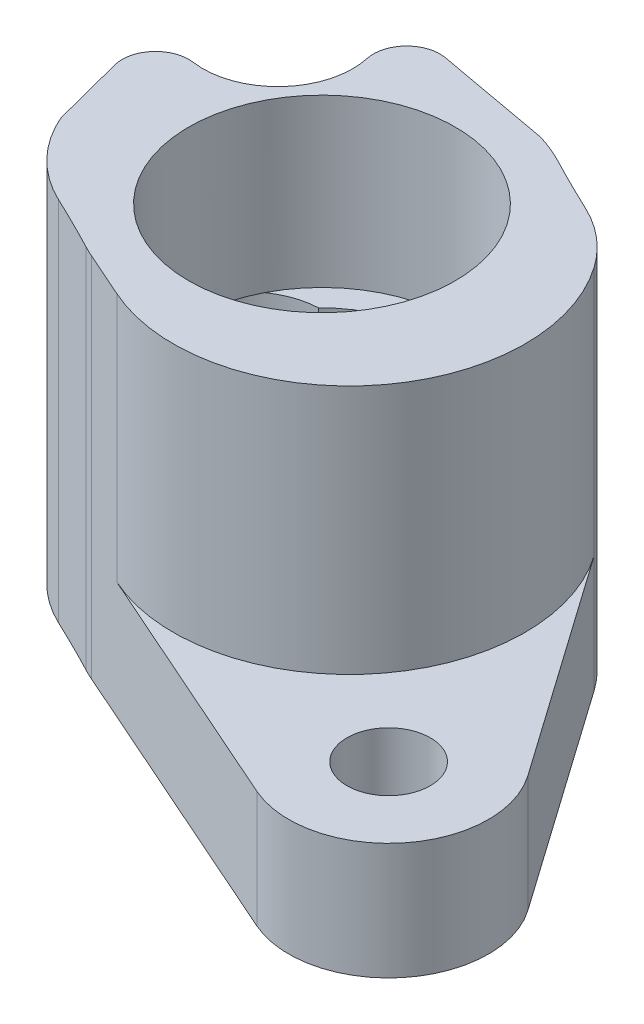
ISO-10303-21;
HEADER;
FILE_DESCRIPTION(('STEP AP214'),'2;1');
FILE_NAME('part.step','',(''),(''),'','','');
FILE_SCHEMA(('AUTOMOTIVE_DESIGN { 1 0 10303 214 1 1 1 1 }'));
ENDSEC;
DATA;
#1=APPLICATION_CONTEXT('core data for automotive mechanical design processes');
#2=APPLICATION_PROTOCOL_DEFINITION('international standard','automotive_design',2000,#1);
#3=PRODUCT_CONTEXT('',#1,'mechanical');
#4=PRODUCT('Part','Part','',(#3));
#5=PRODUCT_RELATED_PRODUCT_CATEGORY('part','',(#4));
#6=PRODUCT_DEFINITION_FORMATION('','',#4);
#7=PRODUCT_DEFINITION_CONTEXT('part definition',#1,'design');
#8=PRODUCT_DEFINITION('design','',#6,#7);
#9=PRODUCT_DEFINITION_SHAPE('','',#8);
#10=(LENGTH_UNIT() NAMED_UNIT(*) SI_UNIT(.MILLI.,.METRE.));
#11=(NAMED_UNIT(*) PLANE_ANGLE_UNIT() SI_UNIT($,.RADIAN.));
#12=(NAMED_UNIT(*) SI_UNIT($,.STERADIAN.) SOLID_ANGLE_UNIT());
#13=UNCERTAINTY_MEASURE_WITH_UNIT(LENGTH_MEASURE(1.E-05),#10,'distance_accuracy_value','');
#14=(GEOMETRIC_REPRESENTATION_CONTEXT(3) GLOBAL_UNCERTAINTY_ASSIGNED_CONTEXT((#13)) GLOBAL_UNIT_ASSIGNED_CONTEXT((#10,
#11,#12)) REPRESENTATION_CONTEXT('',''));
#15=CARTESIAN_POINT('',(0.,0.,0.));
#16=DIRECTION('',(0.,0.,1.));
#17=DIRECTION('',(1.,0.,0.));
#18=AXIS2_PLACEMENT_3D('',#15,#16,#17);
#19=CARTESIAN_POINT('',(4.5,7.,0.));
#20=DIRECTION('',(0.,-1.,0.));
#21=DIRECTION('',(0.,0.,-1.));
#22=AXIS2_PLACEMENT_3D('',#19,#20,#21);
#23=CYLINDRICAL_SURFACE('',#22,4.5);
#24=CARTESIAN_POINT('',(4.5,12.,0.));
#25=DIRECTION('',(0.,1.,0.));
#26=DIRECTION('',(0.,0.,1.));
#27=AXIS2_PLACEMENT_3D('',#24,#25,#26);
#28=CIRCLE('',#27,4.5);
#29=CARTESIAN_POINT('',(4.69444444444444,12.,4.49579707705149));
#30=VERTEX_POINT('',#29);
#31=CARTESIAN_POINT('',(7.11111111111111,12.,3.66498277832681));
#32=VERTEX_POINT('',#31);
#33=EDGE_CURVE('E221',#30,#32,#28,.T.);
#34=ORIENTED_EDGE('',*,*,#33,.T.);
#35=CARTESIAN_POINT('',(4.5,12.,0.));
#36=DIRECTION('',(0.,1.,0.));
#37=DIRECTION('',(0.,0.,1.));
#38=AXIS2_PLACEMENT_3D('',#35,#36,#37);
#39=CIRCLE('',#38,4.5);
#40=CARTESIAN_POINT('',(7.11111111111111,12.,-3.66498277832681));
#41=VERTEX_POINT('',#40);
#42=EDGE_CURVE('E207',#32,#41,#39,.T.);
#43=ORIENTED_EDGE('',*,*,#42,.T.);
#44=CARTESIAN_POINT('',(4.69444444444444,12.,-4.49579707705149));
#45=VERTEX_POINT('',#44);
#46=EDGE_CURVE('E218',#41,#45,#28,.T.);
#47=ORIENTED_EDGE('',*,*,#46,.T.);
#48=DIRECTION('',(0.,-1.,0.));
#49=VECTOR('',#48,1.);
#50=CARTESIAN_POINT('',(4.69444444444444,7.,-4.49579707705149));
#51=LINE('',#50,#49);
#52=CARTESIAN_POINT('',(4.69444444444444,0.,-4.49579707705149));
#53=VERTEX_POINT('',#52);
#54=EDGE_CURVE('E442',#45,#53,#51,.T.);
#55=ORIENTED_EDGE('',*,*,#54,.T.);
#56=CARTESIAN_POINT('',(4.5,0.,0.));
#57=DIRECTION('',(0.,1.,0.));
#58=DIRECTION('',(0.,0.,1.));
#59=AXIS2_PLACEMENT_3D('',#56,#57,#58);
#60=CIRCLE('',#59,4.5);
#61=CARTESIAN_POINT('',(4.69444444444444,0.,4.49579707705149));
#62=VERTEX_POINT('',#61);
#63=EDGE_CURVE('E381',#62,#53,#60,.T.);
#64=ORIENTED_EDGE('',*,*,#63,.F.);
#65=DIRECTION('',(0.,-1.,0.));
#66=VECTOR('',#65,1.);
#67=CARTESIAN_POINT('',(4.69444444444444,7.,4.49579707705149));
#68=LINE('',#67,#66);
#69=EDGE_CURVE('E473',#30,#62,#68,.T.);
#70=ORIENTED_EDGE('',*,*,#69,.F.);
#71=EDGE_LOOP('',(#34,#43,#47,#55,#64,#70));
#72=FACE_BOUND('',#71,.T.);
#73=ADVANCED_FACE('F41',(#72),#23,.F.);
#74=CARTESIAN_POINT('',(-4.5,7.,0.));
#75=DIRECTION('',(0.,-1.,0.));
#76=DIRECTION('',(0.,0.,-1.));
#77=AXIS2_PLACEMENT_3D('',#74,#75,#76);
#78=CYLINDRICAL_SURFACE('',#77,4.5);
#79=CARTESIAN_POINT('',(-4.5,12.,0.));
#80=DIRECTION('',(0.,1.,0.));
#81=DIRECTION('',(0.,0.,1.));
#82=AXIS2_PLACEMENT_3D('',#79,#80,#81);
#83=CIRCLE('',#82,4.5);
#84=CARTESIAN_POINT('',(-7.11111111111111,12.,-3.66498277832681));
#85=VERTEX_POINT('',#84);
#86=CARTESIAN_POINT('',(-7.11111111111111,12.,3.66498277832681));
#87=VERTEX_POINT('',#86);
#88=EDGE_CURVE('E223',#85,#87,#83,.T.);
#89=ORIENTED_EDGE('',*,*,#88,.T.);
#90=CARTESIAN_POINT('',(-4.5,12.,0.));
#91=DIRECTION('',(0.,1.,0.));
#92=DIRECTION('',(0.,0.,1.));
#93=AXIS2_PLACEMENT_3D('',#90,#91,#92);
#94=CIRCLE('',#93,4.5);
#95=CARTESIAN_POINT('',(-4.69444444444444,12.,4.49579707705149));
#96=VERTEX_POINT('',#95);
#97=EDGE_CURVE('E45',#96,#87,#94,.F.);
#98=ORIENTED_EDGE('',*,*,#97,.F.);
#99=DIRECTION('',(0.,-1.,0.));
#100=VECTOR('',#99,1.);
#101=CARTESIAN_POINT('',(-4.69444444444444,7.,4.49579707705149));
#102=LINE('',#101,#100);
#103=CARTESIAN_POINT('',(-4.69444444444444,0.,4.49579707705149));
#104=VERTEX_POINT('',#103);
#105=EDGE_CURVE('E470',#96,#104,#102,.T.);
#106=ORIENTED_EDGE('',*,*,#105,.T.);
#107=CARTESIAN_POINT('',(-4.5,0.,0.));
#108=DIRECTION('',(0.,1.,0.));
#109=DIRECTION('',(0.,0.,1.));
#110=AXIS2_PLACEMENT_3D('',#107,#108,#109);
#111=CIRCLE('',#110,4.5);
#112=CARTESIAN_POINT('',(-4.69444444444445,0.,-4.49579707705149));
#113=VERTEX_POINT('',#112);
#114=EDGE_CURVE('E389',#104,#113,#111,.F.);
#115=ORIENTED_EDGE('',*,*,#114,.T.);
#116=DIRECTION('',(0.,-1.,0.));
#117=VECTOR('',#116,1.);
#118=CARTESIAN_POINT('',(-4.69444444444445,7.,-4.49579707705149));
#119=LINE('',#118,#117);
#120=CARTESIAN_POINT('',(-4.69444444444445,12.,-4.49579707705149));
#121=VERTEX_POINT('',#120);
#122=EDGE_CURVE('E377',#121,#113,#119,.T.);
#123=ORIENTED_EDGE('',*,*,#122,.F.);
#124=EDGE_CURVE('E11',#85,#121,#94,.F.);
#125=ORIENTED_EDGE('',*,*,#124,.F.);
#126=EDGE_LOOP('',(#89,#98,#106,#115,#123,#125));
#127=FACE_BOUND('',#126,.T.);
#128=ADVANCED_FACE('F511',(#127),#78,.F.);
#129=CARTESIAN_POINT('',(0.,7.,0.));
#130=DIRECTION('',(0.,-1.,0.));
#131=DIRECTION('',(0.,0.,-1.));
#132=AXIS2_PLACEMENT_3D('',#129,#130,#131);
#133=CYLINDRICAL_SURFACE('',#132,6.5);
#134=ORIENTED_EDGE('',*,*,#54,.F.);
#135=CARTESIAN_POINT('',(0.,12.,0.));
#136=DIRECTION('',(0.,1.,0.));
#137=DIRECTION('',(0.,0.,1.));
#138=AXIS2_PLACEMENT_3D('',#135,#136,#137);
#139=CIRCLE('',#138,6.5);
#140=EDGE_CURVE('E230',#45,#121,#139,.T.);
#141=ORIENTED_EDGE('',*,*,#140,.T.);
#142=ORIENTED_EDGE('',*,*,#122,.T.);
#143=CARTESIAN_POINT('',(0.,0.,0.));
#144=DIRECTION('',(0.,1.,0.));
#145=DIRECTION('',(0.,0.,1.));
#146=AXIS2_PLACEMENT_3D('',#143,#144,#145);
#147=CIRCLE('',#146,6.5);
#148=EDGE_CURVE('E345',#53,#113,#147,.T.);
#149=ORIENTED_EDGE('',*,*,#148,.F.);
#150=EDGE_LOOP('',(#134,#141,#142,#149));
#151=FACE_BOUND('',#150,.T.);
#152=ADVANCED_FACE('F514',(#151),#133,.F.);
#153=CARTESIAN_POINT('',(0.,7.,0.));
#154=DIRECTION('',(0.,-1.,0.));
#155=DIRECTION('',(0.,0.,-1.));
#156=AXIS2_PLACEMENT_3D('',#153,#154,#155);
#157=CYLINDRICAL_SURFACE('',#156,6.5);
#158=ORIENTED_EDGE('',*,*,#105,.F.);
#159=CARTESIAN_POINT('',(0.,12.,0.));
#160=DIRECTION('',(0.,1.,0.));
#161=DIRECTION('',(0.,0.,1.));
#162=AXIS2_PLACEMENT_3D('',#159,#160,#161);
#163=CIRCLE('',#162,6.5);
#164=EDGE_CURVE('E239',#96,#30,#163,.T.);
#165=ORIENTED_EDGE('',*,*,#164,.T.);
#166=ORIENTED_EDGE('',*,*,#69,.T.);
#167=CARTESIAN_POINT('',(0.,0.,0.));
#168=DIRECTION('',(0.,1.,0.));
#169=DIRECTION('',(0.,0.,1.));
#170=AXIS2_PLACEMENT_3D('',#167,#168,#169);
#171=CIRCLE('',#170,6.5);
#172=EDGE_CURVE('E385',#104,#62,#171,.T.);
#173=ORIENTED_EDGE('',*,*,#172,.F.);
#174=EDGE_LOOP('',(#158,#165,#166,#173));
#175=FACE_BOUND('',#174,.T.);
#176=ADVANCED_FACE('F523',(#175),#157,.F.);
#177=CARTESIAN_POINT('',(0.,7.,0.));
#178=DIRECTION('',(0.,1.,0.));
#179=DIRECTION('',(0.,0.,1.));
#180=AXIS2_PLACEMENT_3D('',#177,#178,#179);
#181=PLANE('',#180);
#182=CARTESIAN_POINT('',(16.0000000000001,7.,12.));
#183=DIRECTION('',(0.,1.,0.));
#184=DIRECTION('',(0.,0.,1.));
#185=AXIS2_PLACEMENT_3D('',#182,#183,#184);
#186=CIRCLE('',#185,2.5);
#187=CARTESIAN_POINT('',(16.0000000000001,7.,14.5));
#188=VERTEX_POINT('',#187);
#189=EDGE_CURVE('E346',#188,#188,#186,.T.);
#190=ORIENTED_EDGE('',*,*,#189,.F.);
#191=EDGE_LOOP('',(#190));
#192=FACE_BOUND('',#191,.T.);
#193=CARTESIAN_POINT('',(2.81741341811794,7.,1.18386679753758));
#194=DIRECTION('',(0.,1.,0.));
#195=DIRECTION('',(0.,0.,1.));
#196=AXIS2_PLACEMENT_3D('',#193,#194,#195);
#197=CIRCLE('',#196,10.5573376484771);
#198=CARTESIAN_POINT('',(-1.4542464793394,7.,10.8384149456597));
#199=VERTEX_POINT('',#198);
#200=CARTESIAN_POINT('',(11.4516960215957,7.,-4.89120868736258));
#201=VERTEX_POINT('',#200);
#202=EDGE_CURVE('E310',#199,#201,#197,.T.);
#203=ORIENTED_EDGE('',*,*,#202,.F.);
#204=DIRECTION('',(0.914487010796204,0.,0.40461525809715));
#205=VECTOR('',#204,1.);
#206=CARTESIAN_POINT('',(-4.24846021002008,7.,9.60211361336014));
#207=LINE('',#206,#205);
#208=CARTESIAN_POINT('',(13.5723084514172,7.,17.4869220647772));
#209=VERTEX_POINT('',#208);
#210=EDGE_CURVE('E367',#199,#209,#207,.T.);
#211=ORIENTED_EDGE('',*,*,#210,.T.);
#212=CARTESIAN_POINT('',(16.0000000000001,7.,12.));
#213=DIRECTION('',(0.,1.,0.));
#214=DIRECTION('',(0.,0.,1.));
#215=AXIS2_PLACEMENT_3D('',#212,#213,#214);
#216=CIRCLE('',#215,6.);
#217=CARTESIAN_POINT('',(20.9070795446559,7.,8.54738210303818));
#218=VERTEX_POINT('',#217);
#219=EDGE_CURVE('E370',#209,#218,#216,.T.);
#220=ORIENTED_EDGE('',*,*,#219,.T.);
#221=DIRECTION('',(0.575436316160303,0.,0.81784659077596));
#222=VECTOR('',#221,1.);
#223=CARTESIAN_POINT('',(9.96162472879303,7.,-7.00899251957429));
#224=LINE('',#223,#222);
#225=EDGE_CURVE('E373',#201,#218,#224,.T.);
#226=ORIENTED_EDGE('',*,*,#225,.F.);
#227=EDGE_LOOP('',(#203,#211,#220,#226));
#228=FACE_BOUND('',#227,.T.);
#229=ADVANCED_FACE('F525',(#192,#228),#181,.T.);
#230=CARTESIAN_POINT('',(3.10184507129617,7.,-10.0313786267729));
#231=DIRECTION('',(0.295413816313921,0.,-0.955369393025988));
#232=DIRECTION('',(-0.955369393025988,0.,-0.295413816313921));
#233=AXIS2_PLACEMENT_3D('',#230,#231,#232);
#234=PLANE('',#233);
#235=DIRECTION('',(0.955369393025988,0.,0.295413816313921));
#236=VECTOR('',#235,1.);
#237=CARTESIAN_POINT('',(3.10184507129617,0.,-10.0313786267729));
#238=LINE('',#237,#236);
#239=CARTESIAN_POINT('',(-8.82169982054453,0.,-13.7183084428228));
#240=VERTEX_POINT('',#239);
#241=CARTESIAN_POINT('',(3.10184507129617,0.,-10.0313786267729));
#242=VERTEX_POINT('',#241);
#243=EDGE_CURVE('E401',#240,#242,#238,.T.);
#244=ORIENTED_EDGE('',*,*,#243,.F.);
#245=DIRECTION('',(0.,-1.,0.));
#246=VECTOR('',#245,1.);
#247=CARTESIAN_POINT('',(-8.82169982054453,7.,-13.7183084428228));
#248=LINE('',#247,#246);
#249=CARTESIAN_POINT('',(-8.82169982054453,7.,-13.7183084428228));
#250=VERTEX_POINT('',#249);
#251=EDGE_CURVE('E464',#250,#240,#248,.T.);
#252=ORIENTED_EDGE('',*,*,#251,.F.);
#253=DIRECTION('',(0.955369393025988,0.,0.295413816313921));
#254=VECTOR('',#253,1.);
#255=CARTESIAN_POINT('',(3.10184507129617,7.,-10.0313786267729));
#256=LINE('',#255,#254);
#257=CARTESIAN_POINT('',(3.10184507129618,7.,-10.0313786267729));
#258=VERTEX_POINT('',#257);
#259=EDGE_CURVE('E355',#250,#258,#256,.T.);
#260=ORIENTED_EDGE('',*,*,#259,.T.);
#261=DIRECTION('',(0.,-1.,0.));
#262=VECTOR('',#261,1.);
#263=CARTESIAN_POINT('',(3.10184507129617,7.,-10.0313786267729));
#264=LINE('',#263,#262);
#265=EDGE_CURVE('E437',#258,#242,#264,.T.);
#266=ORIENTED_EDGE('',*,*,#265,.T.);
#267=EDGE_LOOP('',(#244,#252,#260,#266));
#268=FACE_BOUND('',#267,.T.);
#269=ADVANCED_FACE('F531',(#268),#234,.T.);
#270=CARTESIAN_POINT('',(-10.6043370878193,7.,-7.95325281586443));
#271=DIRECTION('',(0.,-1.,0.));
#272=DIRECTION('',(0.,0.,-1.));
#273=AXIS2_PLACEMENT_3D('',#270,#271,#272);
#274=CYLINDRICAL_SURFACE('',#273,6.03437337331733);
#275=CARTESIAN_POINT('',(-10.6043370878193,0.,-7.95325281586443));
#276=DIRECTION('',(0.,1.,0.));
#277=DIRECTION('',(0.,0.,1.));
#278=AXIS2_PLACEMENT_3D('',#275,#276,#277);
#279=CIRCLE('',#278,6.03437337331733);
#280=CARTESIAN_POINT('',(-16.1478111942284,0.,-5.56923166659305));
#281=VERTEX_POINT('',#280);
#282=EDGE_CURVE('E405',#240,#281,#279,.T.);
#283=ORIENTED_EDGE('',*,*,#282,.T.);
#284=DIRECTION('',(0.,-1.,0.));
#285=VECTOR('',#284,1.);
#286=CARTESIAN_POINT('',(-16.1478111942284,7.,-5.56923166659305));
#287=LINE('',#286,#285);
#288=CARTESIAN_POINT('',(-16.1478111942284,7.,-5.56923166659305));
#289=VERTEX_POINT('',#288);
#290=EDGE_CURVE('E460',#289,#281,#287,.T.);
#291=ORIENTED_EDGE('',*,*,#290,.F.);
#292=CARTESIAN_POINT('',(-10.6043370878193,7.,-7.95325281586443));
#293=DIRECTION('',(0.,1.,0.));
#294=DIRECTION('',(0.,0.,1.));
#295=AXIS2_PLACEMENT_3D('',#292,#293,#294);
#296=CIRCLE('',#295,6.03437337331733);
#297=EDGE_CURVE('E359',#250,#289,#296,.T.);
#298=ORIENTED_EDGE('',*,*,#297,.F.);
#299=ORIENTED_EDGE('',*,*,#251,.T.);
#300=EDGE_LOOP('',(#283,#291,#298,#299));
#301=FACE_BOUND('',#300,.T.);
#302=ADVANCED_FACE('F635',(#301),#274,.T.);
#303=CARTESIAN_POINT('',(-11.6061468845651,7.,4.99132838058419));
#304=DIRECTION('',(0.918649504009994,0.,-0.39507352326142));
#305=DIRECTION('',(-0.39507352326142,0.,-0.918649504009994));
#306=AXIS2_PLACEMENT_3D('',#303,#304,#305);
#307=PLANE('',#306);
#308=DIRECTION('',(0.39507352326142,0.,0.918649504009994));
#309=VECTOR('',#308,1.);
#310=CARTESIAN_POINT('',(-11.6061468845651,0.,4.99132838058419));
#311=LINE('',#310,#309);
#312=CARTESIAN_POINT('',(-12.3085207840849,0.,3.35812494772206));
#313=VERTEX_POINT('',#312);
#314=EDGE_CURVE('E409',#281,#313,#311,.T.);
#315=ORIENTED_EDGE('',*,*,#314,.T.);
#316=DIRECTION('',(0.,-1.,0.));
#317=VECTOR('',#316,1.);
#318=CARTESIAN_POINT('',(-12.3085207840849,7.,3.35812494772206));
#319=LINE('',#318,#317);
#320=CARTESIAN_POINT('',(-12.3085207840849,7.,3.35812494772206));
#321=VERTEX_POINT('',#320);
#322=EDGE_CURVE('E456',#321,#313,#319,.T.);
#323=ORIENTED_EDGE('',*,*,#322,.F.);
#324=DIRECTION('',(0.39507352326142,0.,0.918649504009994));
#325=VECTOR('',#324,1.);
#326=CARTESIAN_POINT('',(-11.6061468845651,7.,4.99132838058419));
#327=LINE('',#326,#325);
#328=EDGE_CURVE('E363',#289,#321,#327,.T.);
#329=ORIENTED_EDGE('',*,*,#328,.F.);
#330=ORIENTED_EDGE('',*,*,#290,.T.);
#331=EDGE_LOOP('',(#315,#323,#329,#330));
#332=FACE_BOUND('',#331,.T.);
#333=ADVANCED_FACE('F632',(#332),#307,.F.);
#334=CARTESIAN_POINT('',(-4.5,7.,0.));
#335=DIRECTION('',(0.,-1.,0.));
#336=DIRECTION('',(0.,0.,-1.));
#337=AXIS2_PLACEMENT_3D('',#334,#335,#336);
#338=CYLINDRICAL_SURFACE('',#337,8.5);
#339=CARTESIAN_POINT('',(-4.5,0.,0.));
#340=DIRECTION('',(0.,1.,0.));
#341=DIRECTION('',(0.,0.,1.));
#342=AXIS2_PLACEMENT_3D('',#339,#340,#341);
#343=CIRCLE('',#342,8.5);
#344=CARTESIAN_POINT('',(-8.12196841511563,0.,7.68969081302394));
#345=VERTEX_POINT('',#344);
#346=EDGE_CURVE('E413',#345,#313,#343,.F.);
#347=ORIENTED_EDGE('',*,*,#346,.F.);
#348=DIRECTION('',(0.,-1.,0.));
#349=VECTOR('',#348,1.);
#350=CARTESIAN_POINT('',(-8.12196841511563,7.,7.68969081302394));
#351=LINE('',#350,#349);
#352=CARTESIAN_POINT('',(-8.12196841511563,22.,7.68969081302393));
#353=VERTEX_POINT('',#352);
#354=EDGE_CURVE('E488',#345,#353,#351,.F.);
#355=ORIENTED_EDGE('',*,*,#354,.T.);
#356=CARTESIAN_POINT('',(-4.5,22.,0.));
#357=DIRECTION('',(0.,1.,0.));
#358=DIRECTION('',(0.,0.,1.));
#359=AXIS2_PLACEMENT_3D('',#356,#357,#358);
#360=CIRCLE('',#359,8.5);
#361=CARTESIAN_POINT('',(-12.3085207840849,22.,3.35812494772206));
#362=VERTEX_POINT('',#361);
#363=EDGE_CURVE('E264',#362,#353,#360,.T.);
#364=ORIENTED_EDGE('',*,*,#363,.F.);
#365=DIRECTION('',(0.,-1.,0.));
#366=VECTOR('',#365,1.);
#367=CARTESIAN_POINT('',(-12.3085207840849,22.,3.35812494772206));
#368=LINE('',#367,#366);
#369=EDGE_CURVE('E335',#362,#321,#368,.T.);
#370=ORIENTED_EDGE('',*,*,#369,.T.);
#371=ORIENTED_EDGE('',*,*,#322,.T.);
#372=EDGE_LOOP('',(#347,#355,#364,#370,#371));
#373=FACE_BOUND('',#372,.T.);
#374=ADVANCED_FACE('F587',(#373),#338,.T.);
#375=CARTESIAN_POINT('',(0.,7.,0.));
#376=DIRECTION('',(0.,-1.,0.));
#377=DIRECTION('',(0.,0.,-1.));
#378=AXIS2_PLACEMENT_3D('',#375,#376,#377);
#379=CYLINDRICAL_SURFACE('',#378,10.5);
#380=DIRECTION('',(0.,-1.,0.));
#381=VECTOR('',#380,1.);
#382=CARTESIAN_POINT('',(-4.24846021002008,7.,9.60211361336014));
#383=LINE('',#382,#381);
#384=CARTESIAN_POINT('',(-4.24846021002008,22.,9.60211361336014));
#385=VERTEX_POINT('',#384);
#386=CARTESIAN_POINT('',(-4.24846021002008,0.,9.60211361336014));
#387=VERTEX_POINT('',#386);
#388=EDGE_CURVE('E452',#385,#387,#383,.T.);
#389=ORIENTED_EDGE('',*,*,#388,.F.);
#390=CARTESIAN_POINT('',(0.,22.,0.));
#391=DIRECTION('',(0.,1.,0.));
#392=DIRECTION('',(0.,0.,1.));
#393=AXIS2_PLACEMENT_3D('',#390,#391,#392);
#394=CIRCLE('',#393,10.5);
#395=CARTESIAN_POINT('',(-4.85530679933666,22.,9.30999440839334));
#396=VERTEX_POINT('',#395);
#397=EDGE_CURVE('E272',#396,#385,#394,.T.);
#398=ORIENTED_EDGE('',*,*,#397,.F.);
#399=DIRECTION('',(0.,-1.,0.));
#400=VECTOR('',#399,1.);
#401=CARTESIAN_POINT('',(-4.85530679933665,7.,9.30999440839334));
#402=LINE('',#401,#400);
#403=CARTESIAN_POINT('',(-4.85530679933665,0.,9.30999440839334));
#404=VERTEX_POINT('',#403);
#405=EDGE_CURVE('E484',#396,#404,#402,.T.);
#406=ORIENTED_EDGE('',*,*,#405,.T.);
#407=CARTESIAN_POINT('',(0.,0.,0.));
#408=DIRECTION('',(0.,1.,0.));
#409=DIRECTION('',(0.,0.,1.));
#410=AXIS2_PLACEMENT_3D('',#407,#408,#409);
#411=CIRCLE('',#410,10.5);
#412=EDGE_CURVE('E416',#404,#387,#411,.T.);
#413=ORIENTED_EDGE('',*,*,#412,.T.);
#414=EDGE_LOOP('',(#389,#398,#406,#413));
#415=FACE_BOUND('',#414,.T.);
#416=ADVANCED_FACE('F592',(#415),#379,.T.);
#417=CARTESIAN_POINT('',(-4.24846021002008,7.,9.60211361336014));
#418=DIRECTION('',(0.40461525809715,0.,-0.914487010796204));
#419=DIRECTION('',(-0.914487010796204,0.,-0.40461525809715));
#420=AXIS2_PLACEMENT_3D('',#417,#418,#419);
#421=PLANE('',#420);
#422=DIRECTION('',(0.914487010796204,0.,0.40461525809715));
#423=VECTOR('',#422,1.);
#424=CARTESIAN_POINT('',(-4.24846021002008,0.,9.60211361336014));
#425=LINE('',#424,#423);
#426=CARTESIAN_POINT('',(13.5723084514172,0.,17.4869220647772));
#427=VERTEX_POINT('',#426);
#428=EDGE_CURVE('E419',#387,#427,#425,.T.);
#429=ORIENTED_EDGE('',*,*,#428,.T.);
#430=DIRECTION('',(0.,-1.,0.));
#431=VECTOR('',#430,1.);
#432=CARTESIAN_POINT('',(13.5723084514172,7.,17.4869220647772));
#433=LINE('',#432,#431);
#434=EDGE_CURVE('E448',#209,#427,#433,.T.);
#435=ORIENTED_EDGE('',*,*,#434,.F.);
#436=ORIENTED_EDGE('',*,*,#210,.F.);
#437=DIRECTION('',(0.,-1.,0.));
#438=VECTOR('',#437,1.);
#439=CARTESIAN_POINT('',(-1.4542464793394,22.,10.8384149456597));
#440=LINE('',#439,#438);
#441=CARTESIAN_POINT('',(-1.4542464793394,22.,10.8384149456597));
#442=VERTEX_POINT('',#441);
#443=EDGE_CURVE('E332',#442,#199,#440,.T.);
#444=ORIENTED_EDGE('',*,*,#443,.F.);
#445=DIRECTION('',(0.914487010796204,0.,0.40461525809715));
#446=VECTOR('',#445,1.);
#447=CARTESIAN_POINT('',(-4.24846021002008,22.,9.60211361336014));
#448=LINE('',#447,#446);
#449=EDGE_CURVE('E276',#385,#442,#448,.T.);
#450=ORIENTED_EDGE('',*,*,#449,.F.);
#451=ORIENTED_EDGE('',*,*,#388,.T.);
#452=EDGE_LOOP('',(#429,#435,#436,#444,#450,#451));
#453=FACE_BOUND('',#452,.T.);
#454=ADVANCED_FACE('F597',(#453),#421,.F.);
#455=CARTESIAN_POINT('',(16.0000000000001,7.,12.));
#456=DIRECTION('',(0.,-1.,0.));
#457=DIRECTION('',(0.,0.,-1.));
#458=AXIS2_PLACEMENT_3D('',#455,#456,#457);
#459=CYLINDRICAL_SURFACE('',#458,6.);
#460=CARTESIAN_POINT('',(16.0000000000001,0.,12.));
#461=DIRECTION('',(0.,1.,0.));
#462=DIRECTION('',(0.,0.,1.));
#463=AXIS2_PLACEMENT_3D('',#460,#461,#462);
#464=CIRCLE('',#463,6.);
#465=CARTESIAN_POINT('',(20.9070795446559,0.,8.54738210303818));
#466=VERTEX_POINT('',#465);
#467=EDGE_CURVE('E423',#427,#466,#464,.T.);
#468=ORIENTED_EDGE('',*,*,#467,.T.);
#469=DIRECTION('',(0.,-1.,0.));
#470=VECTOR('',#469,1.);
#471=CARTESIAN_POINT('',(20.9070795446559,7.,8.54738210303818));
#472=LINE('',#471,#470);
#473=EDGE_CURVE('E445',#218,#466,#472,.T.);
#474=ORIENTED_EDGE('',*,*,#473,.F.);
#475=ORIENTED_EDGE('',*,*,#219,.F.);
#476=ORIENTED_EDGE('',*,*,#434,.T.);
#477=EDGE_LOOP('',(#468,#474,#475,#476));
#478=FACE_BOUND('',#477,.T.);
#479=ADVANCED_FACE('F616',(#478),#459,.T.);
#480=CARTESIAN_POINT('',(9.96162472879303,7.,-7.00899251957429));
#481=DIRECTION('',(0.81784659077596,0.,-0.575436316160303));
#482=DIRECTION('',(-0.575436316160303,0.,-0.81784659077596));
#483=AXIS2_PLACEMENT_3D('',#480,#481,#482);
#484=PLANE('',#483);
#485=DIRECTION('',(0.575436316160303,0.,0.81784659077596));
#486=VECTOR('',#485,1.);
#487=CARTESIAN_POINT('',(9.96162472879303,0.,-7.00899251957429));
#488=LINE('',#487,#486);
#489=CARTESIAN_POINT('',(11.4516960215957,0.,-4.89120868736258));
#490=VERTEX_POINT('',#489);
#491=EDGE_CURVE('E427',#490,#466,#488,.T.);
#492=ORIENTED_EDGE('',*,*,#491,.F.);
#493=DIRECTION('',(0.,-1.,0.));
#494=VECTOR('',#493,1.);
#495=CARTESIAN_POINT('',(11.4516960215957,7.,-4.89120868736258));
#496=LINE('',#495,#494);
#497=EDGE_CURVE('E441',#201,#490,#496,.T.);
#498=ORIENTED_EDGE('',*,*,#497,.F.);
#499=ORIENTED_EDGE('',*,*,#225,.T.);
#500=ORIENTED_EDGE('',*,*,#473,.T.);
#501=EDGE_LOOP('',(#492,#498,#499,#500));
#502=FACE_BOUND('',#501,.T.);
#503=ADVANCED_FACE('F611',(#502),#484,.T.);
#504=CARTESIAN_POINT('',(4.5,7.,0.));
#505=DIRECTION('',(0.,-1.,0.));
#506=DIRECTION('',(0.,0.,-1.));
#507=AXIS2_PLACEMENT_3D('',#504,#505,#506);
#508=CYLINDRICAL_SURFACE('',#507,8.5);
#509=CARTESIAN_POINT('',(4.5,0.,0.));
#510=DIRECTION('',(0.,1.,0.));
#511=DIRECTION('',(0.,0.,1.));
#512=AXIS2_PLACEMENT_3D('',#509,#510,#511);
#513=CIRCLE('',#512,8.5);
#514=CARTESIAN_POINT('',(8.1219684151156,0.,-7.68969081302395));
#515=VERTEX_POINT('',#514);
#516=EDGE_CURVE('E431',#490,#515,#513,.T.);
#517=ORIENTED_EDGE('',*,*,#516,.T.);
#518=DIRECTION('',(0.,-1.,0.));
#519=VECTOR('',#518,1.);
#520=CARTESIAN_POINT('',(8.1219684151156,7.,-7.68969081302395));
#521=LINE('',#520,#519);
#522=CARTESIAN_POINT('',(8.1219684151156,22.,-7.68969081302395));
#523=VERTEX_POINT('',#522);
#524=EDGE_CURVE('E481',#515,#523,#521,.F.);
#525=ORIENTED_EDGE('',*,*,#524,.T.);
#526=CARTESIAN_POINT('',(4.5,22.,0.));
#527=DIRECTION('',(0.,1.,0.));
#528=DIRECTION('',(0.,0.,1.));
#529=AXIS2_PLACEMENT_3D('',#526,#527,#528);
#530=CIRCLE('',#529,8.5);
#531=CARTESIAN_POINT('',(11.4516960215957,22.,-4.89120868736258));
#532=VERTEX_POINT('',#531);
#533=EDGE_CURVE('E282',#532,#523,#530,.T.);
#534=ORIENTED_EDGE('',*,*,#533,.F.);
#535=DIRECTION('',(0.,-1.,0.));
#536=VECTOR('',#535,1.);
#537=CARTESIAN_POINT('',(11.4516960215957,22.,-4.89120868736258));
#538=LINE('',#537,#536);
#539=EDGE_CURVE('E328',#532,#201,#538,.T.);
#540=ORIENTED_EDGE('',*,*,#539,.T.);
#541=ORIENTED_EDGE('',*,*,#497,.T.);
#542=EDGE_LOOP('',(#517,#525,#534,#540,#541));
#543=FACE_BOUND('',#542,.T.);
#544=ADVANCED_FACE('F607',(#543),#508,.T.);
#545=CARTESIAN_POINT('',(-10.6043370878193,7.,-7.95325281586443));
#546=DIRECTION('',(0.,-1.,0.));
#547=DIRECTION('',(0.,0.,-1.));
#548=AXIS2_PLACEMENT_3D('',#545,#546,#547);
#549=CYLINDRICAL_SURFACE('',#548,2.5);
#550=CARTESIAN_POINT('',(-10.6043370878193,7.,-7.95325281586443));
#551=DIRECTION('',(0.,1.,0.));
#552=DIRECTION('',(0.,0.,1.));
#553=AXIS2_PLACEMENT_3D('',#550,#551,#552);
#554=CIRCLE('',#553,2.5);
#555=CARTESIAN_POINT('',(-10.6043370878193,7.,-5.45325281586443));
#556=VERTEX_POINT('',#555);
#557=EDGE_CURVE('E350',#556,#556,#554,.T.);
#558=ORIENTED_EDGE('',*,*,#557,.T.);
#559=EDGE_LOOP('',(#558));
#560=FACE_BOUND('',#559,.T.);
#561=CARTESIAN_POINT('',(-10.6043370878193,0.,-7.95325281586443));
#562=DIRECTION('',(0.,1.,0.));
#563=DIRECTION('',(0.,0.,1.));
#564=AXIS2_PLACEMENT_3D('',#561,#562,#563);
#565=CIRCLE('',#564,2.5);
#566=CARTESIAN_POINT('',(-10.6043370878193,0.,-5.45325281586443));
#567=VERTEX_POINT('',#566);
#568=EDGE_CURVE('E397',#567,#567,#565,.T.);
#569=ORIENTED_EDGE('',*,*,#568,.F.);
#570=EDGE_LOOP('',(#569));
#571=FACE_BOUND('',#570,.T.);
#572=ADVANCED_FACE('F643',(#560,#571),#549,.F.);
#573=CARTESIAN_POINT('',(16.0000000000001,7.,12.));
#574=DIRECTION('',(0.,-1.,0.));
#575=DIRECTION('',(0.,0.,-1.));
#576=AXIS2_PLACEMENT_3D('',#573,#574,#575);
#577=CYLINDRICAL_SURFACE('',#576,2.5);
#578=ORIENTED_EDGE('',*,*,#189,.T.);
#579=EDGE_LOOP('',(#578));
#580=FACE_BOUND('',#579,.T.);
#581=CARTESIAN_POINT('',(16.0000000000001,0.,12.));
#582=DIRECTION('',(0.,1.,0.));
#583=DIRECTION('',(0.,0.,1.));
#584=AXIS2_PLACEMENT_3D('',#581,#582,#583);
#585=CIRCLE('',#584,2.5);
#586=CARTESIAN_POINT('',(16.0000000000001,0.,14.5));
#587=VERTEX_POINT('',#586);
#588=EDGE_CURVE('E393',#587,#587,#585,.T.);
#589=ORIENTED_EDGE('',*,*,#588,.F.);
#590=EDGE_LOOP('',(#589));
#591=FACE_BOUND('',#590,.T.);
#592=ADVANCED_FACE('F646',(#580,#591),#577,.F.);
#593=CARTESIAN_POINT('',(0.,7.,0.));
#594=DIRECTION('',(0.,-1.,0.));
#595=DIRECTION('',(0.,0.,-1.));
#596=AXIS2_PLACEMENT_3D('',#593,#594,#595);
#597=CYLINDRICAL_SURFACE('',#596,10.5);
#598=ORIENTED_EDGE('',*,*,#265,.F.);
#599=DIRECTION('',(0.,-1.,0.));
#600=VECTOR('',#599,1.);
#601=CARTESIAN_POINT('',(3.10184507129618,22.,-10.0313786267729));
#602=LINE('',#601,#600);
#603=CARTESIAN_POINT('',(3.10184507129618,22.,-10.0313786267729));
#604=VERTEX_POINT('',#603);
#605=EDGE_CURVE('E325',#604,#258,#602,.T.);
#606=ORIENTED_EDGE('',*,*,#605,.F.);
#607=CARTESIAN_POINT('',(0.,22.,0.));
#608=DIRECTION('',(0.,1.,0.));
#609=DIRECTION('',(0.,0.,1.));
#610=AXIS2_PLACEMENT_3D('',#607,#608,#609);
#611=CIRCLE('',#610,10.5);
#612=CARTESIAN_POINT('',(4.85530679933662,22.,-9.30999440839335));
#613=VERTEX_POINT('',#612);
#614=EDGE_CURVE('E290',#613,#604,#611,.T.);
#615=ORIENTED_EDGE('',*,*,#614,.F.);
#616=DIRECTION('',(0.,-1.,0.));
#617=VECTOR('',#616,1.);
#618=CARTESIAN_POINT('',(4.85530679933662,7.,-9.30999440839336));
#619=LINE('',#618,#617);
#620=CARTESIAN_POINT('',(4.85530679933662,0.,-9.30999440839336));
#621=VERTEX_POINT('',#620);
#622=EDGE_CURVE('E467',#613,#621,#619,.T.);
#623=ORIENTED_EDGE('',*,*,#622,.T.);
#624=CARTESIAN_POINT('',(0.,0.,0.));
#625=DIRECTION('',(0.,1.,0.));
#626=DIRECTION('',(0.,0.,1.));
#627=AXIS2_PLACEMENT_3D('',#624,#625,#626);
#628=CIRCLE('',#627,10.5);
#629=EDGE_CURVE('E351',#621,#242,#628,.T.);
#630=ORIENTED_EDGE('',*,*,#629,.T.);
#631=EDGE_LOOP('',(#598,#606,#615,#623,#630));
#632=FACE_BOUND('',#631,.T.);
#633=ADVANCED_FACE('F564',(#632),#597,.T.);
#634=CARTESIAN_POINT('',(-4.25352807607591,7.,-9.33789172054634));
#635=DIRECTION('',(0.,1.,0.));
#636=DIRECTION('',(0.,0.,1.));
#637=AXIS2_PLACEMENT_3D('',#634,#635,#636);
#638=CIRCLE('',#637,2.);
#639=CARTESIAN_POINT('',(-3.89522326654847,7.,-11.3055343871577));
#640=VERTEX_POINT('',#639);
#641=CARTESIAN_POINT('',(-6.20762315661234,7.,-8.91184898064422));
#642=VERTEX_POINT('',#641);
#643=EDGE_CURVE('E257',#640,#642,#638,.T.);
#644=ORIENTED_EDGE('',*,*,#643,.F.);
#645=DIRECTION('',(0.983821333305686,0.,0.179152404763717));
#646=VECTOR('',#645,1.);
#647=CARTESIAN_POINT('',(1.86762571380427,7.,-10.25612814014));
#648=LINE('',#647,#646);
#649=EDGE_CURVE('E313',#640,#258,#648,.T.);
#650=ORIENTED_EDGE('',*,*,#649,.T.);
#651=ORIENTED_EDGE('',*,*,#259,.F.);
#652=ORIENTED_EDGE('',*,*,#297,.T.);
#653=ORIENTED_EDGE('',*,*,#328,.T.);
#654=DIRECTION('',(0.252032006088508,0.,0.967718899219707));
#655=VECTOR('',#654,1.);
#656=CARTESIAN_POINT('',(-12.3457156152864,7.,3.21530919322515));
#657=LINE('',#656,#655);
#658=CARTESIAN_POINT('',(-13.4468800977769,7.,-1.01279539314789));
#659=VERTEX_POINT('',#658);
#660=EDGE_CURVE('E307',#659,#321,#657,.T.);
#661=ORIENTED_EDGE('',*,*,#660,.F.);
#662=CARTESIAN_POINT('',(-11.5114422993375,7.,-1.51685940532491));
#663=DIRECTION('',(0.,1.,0.));
#664=DIRECTION('',(0.,0.,1.));
#665=AXIS2_PLACEMENT_3D('',#662,#663,#664);
#666=CIRCLE('',#665,2.);
#667=CARTESIAN_POINT('',(-11.2323330034858,7.,-3.49728814702938));
#668=VERTEX_POINT('',#667);
#669=EDGE_CURVE('E303',#659,#668,#666,.F.);
#670=ORIENTED_EDGE('',*,*,#669,.T.);
#671=CARTESIAN_POINT('',(-10.6043370878193,7.,-7.95325281586443));
#672=DIRECTION('',(0.,1.,0.));
#673=DIRECTION('',(0.,0.,1.));
#674=AXIS2_PLACEMENT_3D('',#671,#672,#673);
#675=CIRCLE('',#674,4.5);
#676=EDGE_CURVE('E57',#668,#642,#675,.T.);
#677=ORIENTED_EDGE('',*,*,#676,.T.);
#678=EDGE_LOOP('',(#644,#650,#651,#652,#653,#661,#670,#677));
#679=FACE_BOUND('',#678,.T.);
#680=ORIENTED_EDGE('',*,*,#557,.F.);
#681=EDGE_LOOP('',(#680));
#682=FACE_BOUND('',#681,.T.);
#683=ADVANCED_FACE('F534',(#679,#682),#181,.T.);
#684=CARTESIAN_POINT('',(0.,0.,0.));
#685=DIRECTION('',(0.,1.,0.));
#686=DIRECTION('',(0.,0.,1.));
#687=AXIS2_PLACEMENT_3D('',#684,#685,#686);
#688=PLANE('',#687);
#689=ORIENTED_EDGE('',*,*,#148,.T.);
#690=ORIENTED_EDGE('',*,*,#114,.F.);
#691=ORIENTED_EDGE('',*,*,#172,.T.);
#692=ORIENTED_EDGE('',*,*,#63,.T.);
#693=EDGE_LOOP('',(#689,#690,#691,#692));
#694=FACE_BOUND('',#693,.T.);
#695=ORIENTED_EDGE('',*,*,#588,.T.);
#696=EDGE_LOOP('',(#695));
#697=FACE_BOUND('',#696,.T.);
#698=ORIENTED_EDGE('',*,*,#568,.T.);
#699=EDGE_LOOP('',(#698));
#700=FACE_BOUND('',#699,.T.);
#701=ORIENTED_EDGE('',*,*,#243,.T.);
#702=ORIENTED_EDGE('',*,*,#629,.F.);
#703=CARTESIAN_POINT('',(46.472222222222,0.,-89.1099464803364));
#704=DIRECTION('',(0.,1.,0.));
#705=DIRECTION('',(0.,0.,1.));
#706=AXIS2_PLACEMENT_3D('',#703,#704,#705);
#707=CIRCLE('',#706,90.);
#708=EDGE_CURVE('E491',#621,#515,#707,.T.);
#709=ORIENTED_EDGE('',*,*,#708,.T.);
#710=ORIENTED_EDGE('',*,*,#516,.F.);
#711=ORIENTED_EDGE('',*,*,#491,.T.);
#712=ORIENTED_EDGE('',*,*,#467,.F.);
#713=ORIENTED_EDGE('',*,*,#428,.F.);
#714=ORIENTED_EDGE('',*,*,#412,.F.);
#715=CARTESIAN_POINT('',(-46.4722222222223,0.,89.1099464803362));
#716=DIRECTION('',(0.,1.,0.));
#717=DIRECTION('',(0.,0.,1.));
#718=AXIS2_PLACEMENT_3D('',#715,#716,#717);
#719=CIRCLE('',#718,90.);
#720=EDGE_CURVE('E65',#404,#345,#719,.T.);
#721=ORIENTED_EDGE('',*,*,#720,.T.);
#722=ORIENTED_EDGE('',*,*,#346,.T.);
#723=ORIENTED_EDGE('',*,*,#314,.F.);
#724=ORIENTED_EDGE('',*,*,#282,.F.);
#725=EDGE_LOOP('',(#701,#702,#709,#710,#711,#712,#713,#714,#721,#722,#723,#724));
#726=FACE_BOUND('',#725,.T.);
#727=ADVANCED_FACE('F520',(#694,#697,#700,#726),#688,.F.);
#728=CARTESIAN_POINT('',(46.472222222222,7.,-89.1099464803364));
#729=DIRECTION('',(0.,1.,0.));
#730=DIRECTION('',(0.,0.,1.));
#731=AXIS2_PLACEMENT_3D('',#728,#729,#730);
#732=CYLINDRICAL_SURFACE('',#731,90.);
#733=ORIENTED_EDGE('',*,*,#622,.F.);
#734=CARTESIAN_POINT('',(46.472222222222,22.,-89.1099464803364));
#735=DIRECTION('',(0.,1.,0.));
#736=DIRECTION('',(0.,0.,1.));
#737=AXIS2_PLACEMENT_3D('',#734,#735,#736);
#738=CIRCLE('',#737,90.);
#739=EDGE_CURVE('E286',#523,#613,#738,.F.);
#740=ORIENTED_EDGE('',*,*,#739,.F.);
#741=ORIENTED_EDGE('',*,*,#524,.F.);
#742=ORIENTED_EDGE('',*,*,#708,.F.);
#743=EDGE_LOOP('',(#733,#740,#741,#742));
#744=FACE_BOUND('',#743,.T.);
#745=ADVANCED_FACE('F542',(#744),#732,.F.);
#746=CARTESIAN_POINT('',(-46.4722222222223,7.,89.1099464803362));
#747=DIRECTION('',(0.,1.,0.));
#748=DIRECTION('',(0.,0.,1.));
#749=AXIS2_PLACEMENT_3D('',#746,#747,#748);
#750=CYLINDRICAL_SURFACE('',#749,90.);
#751=ORIENTED_EDGE('',*,*,#405,.F.);
#752=CARTESIAN_POINT('',(-46.4722222222223,22.,89.1099464803362));
#753=DIRECTION('',(0.,1.,0.));
#754=DIRECTION('',(0.,0.,1.));
#755=AXIS2_PLACEMENT_3D('',#752,#753,#754);
#756=CIRCLE('',#755,90.);
#757=EDGE_CURVE('E268',#353,#396,#756,.F.);
#758=ORIENTED_EDGE('',*,*,#757,.F.);
#759=ORIENTED_EDGE('',*,*,#354,.F.);
#760=ORIENTED_EDGE('',*,*,#720,.F.);
#761=EDGE_LOOP('',(#751,#758,#759,#760));
#762=FACE_BOUND('',#761,.T.);
#763=ADVANCED_FACE('F43',(#762),#750,.F.);
#764=CARTESIAN_POINT('',(-10.6043370878193,22.,-7.95325281586443));
#765=DIRECTION('',(0.,-1.,0.));
#766=DIRECTION('',(0.,0.,-1.));
#767=AXIS2_PLACEMENT_3D('',#764,#765,#766);
#768=CYLINDRICAL_SURFACE('',#767,4.5);
#769=ORIENTED_EDGE('',*,*,#676,.F.);
#770=DIRECTION('',(0.,-1.,0.));
#771=VECTOR('',#770,1.);
#772=CARTESIAN_POINT('',(-11.2323330034858,22.,-3.49728814702938));
#773=LINE('',#772,#771);
#774=CARTESIAN_POINT('',(-11.2323330034858,22.,-3.49728814702938));
#775=VERTEX_POINT('',#774);
#776=EDGE_CURVE('E342',#775,#668,#773,.T.);
#777=ORIENTED_EDGE('',*,*,#776,.F.);
#778=CARTESIAN_POINT('',(-10.6043370878193,22.,-7.95325281586443));
#779=DIRECTION('',(0.,1.,0.));
#780=DIRECTION('',(0.,0.,1.));
#781=AXIS2_PLACEMENT_3D('',#778,#779,#780);
#782=CIRCLE('',#781,4.5);
#783=CARTESIAN_POINT('',(-6.20762315661234,22.,-8.91184898064422));
#784=VERTEX_POINT('',#783);
#785=EDGE_CURVE('E252',#775,#784,#782,.T.);
#786=ORIENTED_EDGE('',*,*,#785,.T.);
#787=DIRECTION('',(0.,-1.,0.));
#788=VECTOR('',#787,1.);
#789=CARTESIAN_POINT('',(-6.20762315661234,22.,-8.91184898064422));
#790=LINE('',#789,#788);
#791=EDGE_CURVE('E300',#784,#642,#790,.T.);
#792=ORIENTED_EDGE('',*,*,#791,.T.);
#793=EDGE_LOOP('',(#769,#777,#786,#792));
#794=FACE_BOUND('',#793,.T.);
#795=ADVANCED_FACE('F549',(#794),#768,.F.);
#796=CARTESIAN_POINT('',(-11.5114422993375,22.,-1.51685940532491));
#797=DIRECTION('',(0.,-1.,0.));
#798=DIRECTION('',(0.,0.,-1.));
#799=AXIS2_PLACEMENT_3D('',#796,#797,#798);
#800=CYLINDRICAL_SURFACE('',#799,2.);
#801=ORIENTED_EDGE('',*,*,#669,.F.);
#802=DIRECTION('',(0.,-1.,0.));
#803=VECTOR('',#802,1.);
#804=CARTESIAN_POINT('',(-13.4468800977769,22.,-1.01279539314789));
#805=LINE('',#804,#803);
#806=CARTESIAN_POINT('',(-13.4468800977769,22.,-1.01279539314789));
#807=VERTEX_POINT('',#806);
#808=EDGE_CURVE('E339',#807,#659,#805,.T.);
#809=ORIENTED_EDGE('',*,*,#808,.F.);
#810=CARTESIAN_POINT('',(-11.5114422993375,22.,-1.51685940532491));
#811=DIRECTION('',(0.,1.,0.));
#812=DIRECTION('',(0.,0.,1.));
#813=AXIS2_PLACEMENT_3D('',#810,#811,#812);
#814=CIRCLE('',#813,2.);
#815=EDGE_CURVE('E256',#807,#775,#814,.F.);
#816=ORIENTED_EDGE('',*,*,#815,.T.);
#817=ORIENTED_EDGE('',*,*,#776,.T.);
#818=EDGE_LOOP('',(#801,#809,#816,#817));
#819=FACE_BOUND('',#818,.T.);
#820=ADVANCED_FACE('F576',(#819),#800,.T.);
#821=CARTESIAN_POINT('',(-12.3457156152864,22.,3.21530919322515));
#822=DIRECTION('',(0.967718899219707,0.,-0.252032006088508));
#823=DIRECTION('',(-0.252032006088508,0.,-0.967718899219707));
#824=AXIS2_PLACEMENT_3D('',#821,#822,#823);
#825=PLANE('',#824);
#826=ORIENTED_EDGE('',*,*,#660,.T.);
#827=ORIENTED_EDGE('',*,*,#369,.F.);
#828=DIRECTION('',(0.252032006088508,0.,0.967718899219707));
#829=VECTOR('',#828,1.);
#830=CARTESIAN_POINT('',(-12.3457156152864,22.,3.21530919322515));
#831=LINE('',#830,#829);
#832=EDGE_CURVE('E261',#807,#362,#831,.T.);
#833=ORIENTED_EDGE('',*,*,#832,.F.);
#834=ORIENTED_EDGE('',*,*,#808,.T.);
#835=EDGE_LOOP('',(#826,#827,#833,#834));
#836=FACE_BOUND('',#835,.T.);
#837=ADVANCED_FACE('F583',(#836),#825,.F.);
#838=CARTESIAN_POINT('',(2.81741341811794,22.,1.18386679753758));
#839=DIRECTION('',(0.,-1.,0.));
#840=DIRECTION('',(0.,0.,-1.));
#841=AXIS2_PLACEMENT_3D('',#838,#839,#840);
#842=CYLINDRICAL_SURFACE('',#841,10.5573376484771);
#843=ORIENTED_EDGE('',*,*,#202,.T.);
#844=ORIENTED_EDGE('',*,*,#539,.F.);
#845=CARTESIAN_POINT('',(2.81741341811794,22.,1.18386679753758));
#846=DIRECTION('',(0.,1.,0.));
#847=DIRECTION('',(0.,0.,1.));
#848=AXIS2_PLACEMENT_3D('',#845,#846,#847);
#849=CIRCLE('',#848,10.5573376484771);
#850=EDGE_CURVE('E279',#442,#532,#849,.T.);
#851=ORIENTED_EDGE('',*,*,#850,.F.);
#852=ORIENTED_EDGE('',*,*,#443,.T.);
#853=EDGE_LOOP('',(#843,#844,#851,#852));
#854=FACE_BOUND('',#853,.T.);
#855=ADVANCED_FACE('F604',(#854),#842,.T.);
#856=CARTESIAN_POINT('',(1.86762571380427,22.,-10.25612814014));
#857=DIRECTION('',(0.179152404763717,0.,-0.983821333305686));
#858=DIRECTION('',(-0.983821333305686,0.,-0.179152404763717));
#859=AXIS2_PLACEMENT_3D('',#856,#857,#858);
#860=PLANE('',#859);
#861=ORIENTED_EDGE('',*,*,#649,.F.);
#862=DIRECTION('',(0.,-1.,0.));
#863=VECTOR('',#862,1.);
#864=CARTESIAN_POINT('',(-3.89522326654847,22.,-11.3055343871577));
#865=LINE('',#864,#863);
#866=CARTESIAN_POINT('',(-3.89522326654847,22.,-11.3055343871577));
#867=VERTEX_POINT('',#866);
#868=EDGE_CURVE('E322',#867,#640,#865,.T.);
#869=ORIENTED_EDGE('',*,*,#868,.F.);
#870=DIRECTION('',(0.983821333305686,0.,0.179152404763717));
#871=VECTOR('',#870,1.);
#872=CARTESIAN_POINT('',(1.86762571380427,22.,-10.25612814014));
#873=LINE('',#872,#871);
#874=EDGE_CURVE('E293',#867,#604,#873,.T.);
#875=ORIENTED_EDGE('',*,*,#874,.T.);
#876=ORIENTED_EDGE('',*,*,#605,.T.);
#877=EDGE_LOOP('',(#861,#869,#875,#876));
#878=FACE_BOUND('',#877,.T.);
#879=ADVANCED_FACE('F567',(#878),#860,.T.);
#880=CARTESIAN_POINT('',(-4.25352807607591,22.,-9.33789172054634));
#881=DIRECTION('',(0.,-1.,0.));
#882=DIRECTION('',(0.,0.,-1.));
#883=AXIS2_PLACEMENT_3D('',#880,#881,#882);
#884=CYLINDRICAL_SURFACE('',#883,2.);
#885=ORIENTED_EDGE('',*,*,#643,.T.);
#886=ORIENTED_EDGE('',*,*,#791,.F.);
#887=CARTESIAN_POINT('',(-4.25352807607591,22.,-9.33789172054634));
#888=DIRECTION('',(0.,1.,0.));
#889=DIRECTION('',(0.,0.,1.));
#890=AXIS2_PLACEMENT_3D('',#887,#888,#889);
#891=CIRCLE('',#890,2.);
#892=EDGE_CURVE('E297',#867,#784,#891,.T.);
#893=ORIENTED_EDGE('',*,*,#892,.F.);
#894=ORIENTED_EDGE('',*,*,#868,.T.);
#895=EDGE_LOOP('',(#885,#886,#893,#894));
#896=FACE_BOUND('',#895,.T.);
#897=ADVANCED_FACE('F572',(#896),#884,.T.);
#898=CARTESIAN_POINT('',(0.,22.,0.));
#899=DIRECTION('',(0.,1.,0.));
#900=DIRECTION('',(0.,0.,1.));
#901=AXIS2_PLACEMENT_3D('',#898,#899,#900);
#902=PLANE('',#901);
#903=CARTESIAN_POINT('',(0.,22.,0.));
#904=DIRECTION('',(0.,1.,0.));
#905=DIRECTION('',(0.,0.,1.));
#906=AXIS2_PLACEMENT_3D('',#903,#904,#905);
#907=CIRCLE('',#906,8.);
#908=CARTESIAN_POINT('',(0.,22.,8.));
#909=VERTEX_POINT('',#908);
#910=EDGE_CURVE('E495',#909,#909,#907,.T.);
#911=ORIENTED_EDGE('',*,*,#910,.F.);
#912=EDGE_LOOP('',(#911));
#913=FACE_BOUND('',#912,.T.);
#914=ORIENTED_EDGE('',*,*,#785,.F.);
#915=ORIENTED_EDGE('',*,*,#815,.F.);
#916=ORIENTED_EDGE('',*,*,#832,.T.);
#917=ORIENTED_EDGE('',*,*,#363,.T.);
#918=ORIENTED_EDGE('',*,*,#757,.T.);
#919=ORIENTED_EDGE('',*,*,#397,.T.);
#920=ORIENTED_EDGE('',*,*,#449,.T.);
#921=ORIENTED_EDGE('',*,*,#850,.T.);
#922=ORIENTED_EDGE('',*,*,#533,.T.);
#923=ORIENTED_EDGE('',*,*,#739,.T.);
#924=ORIENTED_EDGE('',*,*,#614,.T.);
#925=ORIENTED_EDGE('',*,*,#874,.F.);
#926=ORIENTED_EDGE('',*,*,#892,.T.);
#927=EDGE_LOOP('',(#914,#915,#916,#917,#918,#919,#920,#921,#922,#923,#924,#925,#926));
#928=FACE_BOUND('',#927,.T.);
#929=ADVANCED_FACE('F559',(#913,#928),#902,.T.);
#930=CARTESIAN_POINT('',(0.,12.,0.));
#931=DIRECTION('',(0.,1.,0.));
#932=DIRECTION('',(0.,0.,1.));
#933=AXIS2_PLACEMENT_3D('',#930,#931,#932);
#934=PLANE('',#933);
#935=ORIENTED_EDGE('',*,*,#164,.F.);
#936=ORIENTED_EDGE('',*,*,#97,.T.);
#937=CARTESIAN_POINT('',(0.,12.,0.));
#938=DIRECTION('',(0.,1.,0.));
#939=DIRECTION('',(0.,0.,1.));
#940=AXIS2_PLACEMENT_3D('',#937,#938,#939);
#941=CIRCLE('',#940,8.);
#942=EDGE_CURVE('E240',#87,#32,#941,.T.);
#943=ORIENTED_EDGE('',*,*,#942,.T.);
#944=ORIENTED_EDGE('',*,*,#33,.F.);
#945=EDGE_LOOP('',(#935,#936,#943,#944));
#946=FACE_BOUND('',#945,.T.);
#947=ADVANCED_FACE('F504',(#946),#934,.T.);
#948=EDGE_CURVE('E227',#41,#85,#941,.T.);
#949=ORIENTED_EDGE('',*,*,#948,.T.);
#950=ORIENTED_EDGE('',*,*,#124,.T.);
#951=ORIENTED_EDGE('',*,*,#140,.F.);
#952=ORIENTED_EDGE('',*,*,#46,.F.);
#953=EDGE_LOOP('',(#949,#950,#951,#952));
#954=FACE_BOUND('',#953,.T.);
#955=ADVANCED_FACE('F226',(#954),#934,.T.);
#956=CARTESIAN_POINT('',(0.,12.,0.));
#957=DIRECTION('',(0.,1.,0.));
#958=DIRECTION('',(0.,0.,1.));
#959=AXIS2_PLACEMENT_3D('',#956,#957,#958);
#960=CYLINDRICAL_SURFACE('',#959,8.);
#961=ORIENTED_EDGE('',*,*,#910,.T.);
#962=EDGE_LOOP('',(#961));
#963=FACE_BOUND('',#962,.T.);
#964=ORIENTED_EDGE('',*,*,#948,.F.);
#965=CARTESIAN_POINT('',(0.,12.,0.));
#966=DIRECTION('',(0.,-1.,0.));
#967=DIRECTION('',(0.,0.,1.));
#968=AXIS2_PLACEMENT_3D('',#965,#966,#967);
#969=CIRCLE('',#968,8.);
#970=EDGE_CURVE('E204',#41,#32,#969,.T.);
#971=ORIENTED_EDGE('',*,*,#970,.T.);
#972=ORIENTED_EDGE('',*,*,#942,.F.);
#973=CARTESIAN_POINT('',(0.,12.,0.));
#974=DIRECTION('',(0.,-1.,0.));
#975=DIRECTION('',(0.,0.,1.));
#976=AXIS2_PLACEMENT_3D('',#973,#974,#975);
#977=CIRCLE('',#976,8.);
#978=EDGE_CURVE('E236',#87,#85,#977,.T.);
#979=ORIENTED_EDGE('',*,*,#978,.T.);
#980=EDGE_LOOP('',(#964,#971,#972,#979));
#981=FACE_BOUND('',#980,.T.);
#982=ADVANCED_FACE('F234',(#963,#981),#960,.F.);
#983=CARTESIAN_POINT('',(-2.25,12.,0.));
#984=DIRECTION('',(0.,1.,0.));
#985=DIRECTION('',(0.,0.,1.));
#986=AXIS2_PLACEMENT_3D('',#983,#984,#985);
#987=PLANE('',#986);
#988=ORIENTED_EDGE('',*,*,#88,.F.);
#989=ORIENTED_EDGE('',*,*,#978,.F.);
#990=EDGE_LOOP('',(#988,#989));
#991=FACE_BOUND('',#990,.T.);
#992=ADVANCED_FACE('F508',(#991),#987,.F.);
#993=CARTESIAN_POINT('',(2.25,12.,0.));
#994=DIRECTION('',(0.,1.,0.));
#995=DIRECTION('',(0.,0.,1.));
#996=AXIS2_PLACEMENT_3D('',#993,#994,#995);
#997=PLANE('',#996);
#998=ORIENTED_EDGE('',*,*,#970,.F.);
#999=ORIENTED_EDGE('',*,*,#42,.F.);
#1000=EDGE_LOOP('',(#998,#999));
#1001=FACE_BOUND('',#1000,.T.);
#1002=ADVANCED_FACE('F206',(#1001),#997,.F.);
#1003=CLOSED_SHELL('',(#73,#128,#152,#176,#229,#269,#302,#333,#374,#416,#454,#479,#503,#544,
#572,#592,#633,#683,#727,#745,#763,#795,#820,#837,#855,#879,#897,#929,#947,#955,#982,#992,#1002));
#1004=MANIFOLD_SOLID_BREP('B2',#1003);
#1005=ADVANCED_BREP_SHAPE_REPRESENTATION('',(#18,#1004),#14);
#1006=SHAPE_DEFINITION_REPRESENTATION(#9,#1005);
ENDSEC;
END-ISO-10303-21;
